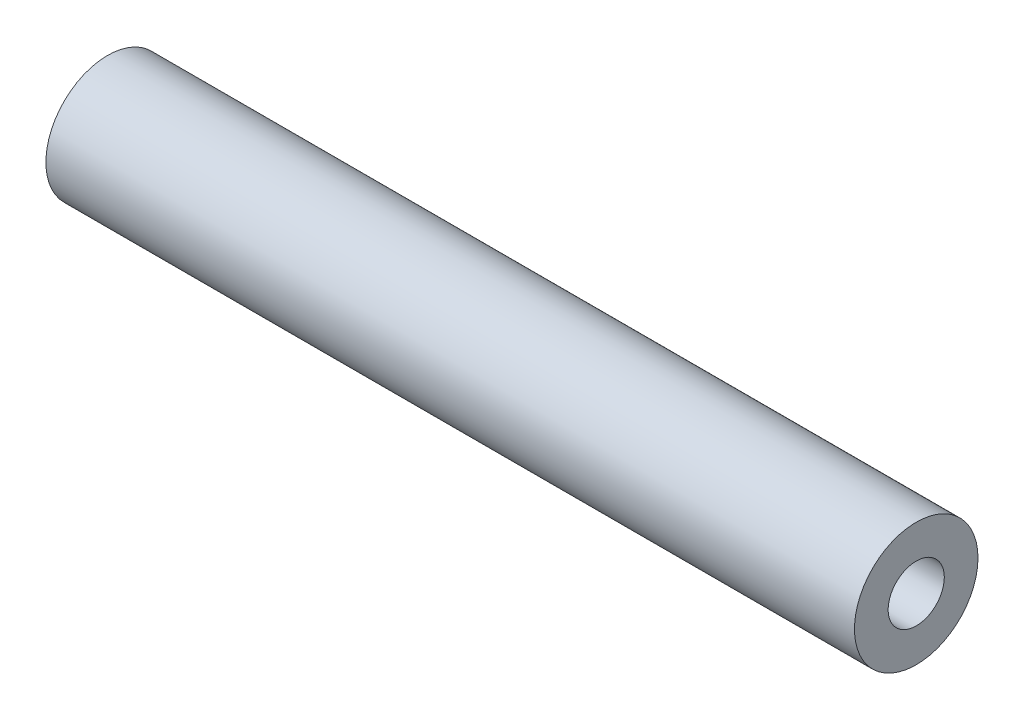
ISO-10303-21;
HEADER;
FILE_DESCRIPTION(('STEP AP214'),'2;1');
FILE_NAME('part.step','',(''),(''),'','','');
FILE_SCHEMA(('AUTOMOTIVE_DESIGN { 1 0 10303 214 1 1 1 1 }'));
ENDSEC;
DATA;
#1=APPLICATION_CONTEXT('core data for automotive mechanical design processes');
#2=APPLICATION_PROTOCOL_DEFINITION('international standard','automotive_design',2000,#1);
#3=PRODUCT_CONTEXT('',#1,'mechanical');
#4=PRODUCT('Part','Part','',(#3));
#5=PRODUCT_RELATED_PRODUCT_CATEGORY('part','',(#4));
#6=PRODUCT_DEFINITION_FORMATION('','',#4);
#7=PRODUCT_DEFINITION_CONTEXT('part definition',#1,'design');
#8=PRODUCT_DEFINITION('design','',#6,#7);
#9=PRODUCT_DEFINITION_SHAPE('','',#8);
#10=(LENGTH_UNIT() NAMED_UNIT(*) SI_UNIT(.MILLI.,.METRE.));
#11=(NAMED_UNIT(*) PLANE_ANGLE_UNIT() SI_UNIT($,.RADIAN.));
#12=(NAMED_UNIT(*) SI_UNIT($,.STERADIAN.) SOLID_ANGLE_UNIT());
#13=UNCERTAINTY_MEASURE_WITH_UNIT(LENGTH_MEASURE(1.E-05),#10,'distance_accuracy_value','');
#14=(GEOMETRIC_REPRESENTATION_CONTEXT(3) GLOBAL_UNCERTAINTY_ASSIGNED_CONTEXT((#13)) GLOBAL_UNIT_ASSIGNED_CONTEXT((#10,
#11,#12)) REPRESENTATION_CONTEXT('',''));
#15=CARTESIAN_POINT('',(0.,0.,0.));
#16=DIRECTION('',(0.,0.,1.));
#17=DIRECTION('',(1.,0.,0.));
#18=AXIS2_PLACEMENT_3D('',#15,#16,#17);
#19=CARTESIAN_POINT('',(45.72,0.,0.));
#20=DIRECTION('',(-1.,0.,0.));
#21=DIRECTION('',(0.,0.,1.));
#22=AXIS2_PLACEMENT_3D('',#19,#20,#21);
#23=CYLINDRICAL_SURFACE('',#22,1.5875);
#24=CARTESIAN_POINT('',(45.72,0.,0.));
#25=DIRECTION('',(1.,0.,0.));
#26=DIRECTION('',(0.,0.,-1.));
#27=AXIS2_PLACEMENT_3D('',#24,#25,#26);
#28=CIRCLE('',#27,1.5875);
#29=CARTESIAN_POINT('',(45.72,0.,-1.5875));
#30=VERTEX_POINT('',#29);
#31=EDGE_CURVE('E51',#30,#30,#28,.T.);
#32=ORIENTED_EDGE('',*,*,#31,.T.);
#33=EDGE_LOOP('',(#32));
#34=FACE_BOUND('',#33,.T.);
#35=CARTESIAN_POINT('',(0.,0.,0.));
#36=DIRECTION('',(1.,0.,0.));
#37=DIRECTION('',(0.,0.,-1.));
#38=AXIS2_PLACEMENT_3D('',#35,#36,#37);
#39=CIRCLE('',#38,1.5875);
#40=CARTESIAN_POINT('',(0.,0.,-1.5875));
#41=VERTEX_POINT('',#40);
#42=EDGE_CURVE('E58',#41,#41,#39,.T.);
#43=ORIENTED_EDGE('',*,*,#42,.F.);
#44=EDGE_LOOP('',(#43));
#45=FACE_BOUND('',#44,.T.);
#46=ADVANCED_FACE('F43',(#34,#45),#23,.F.);
#47=CARTESIAN_POINT('',(45.72,0.,0.));
#48=DIRECTION('',(-1.,0.,0.));
#49=DIRECTION('',(0.,0.,1.));
#50=AXIS2_PLACEMENT_3D('',#47,#48,#49);
#51=CYLINDRICAL_SURFACE('',#50,3.4925);
#52=CARTESIAN_POINT('',(45.72,0.,0.));
#53=DIRECTION('',(1.,0.,0.));
#54=DIRECTION('',(0.,0.,-1.));
#55=AXIS2_PLACEMENT_3D('',#52,#53,#54);
#56=CIRCLE('',#55,3.4925);
#57=CARTESIAN_POINT('',(45.72,0.,-3.4925));
#58=VERTEX_POINT('',#57);
#59=EDGE_CURVE('E10',#58,#58,#56,.T.);
#60=ORIENTED_EDGE('',*,*,#59,.F.);
#61=EDGE_LOOP('',(#60));
#62=FACE_BOUND('',#61,.T.);
#63=CARTESIAN_POINT('',(0.,0.,0.));
#64=DIRECTION('',(1.,0.,0.));
#65=DIRECTION('',(0.,0.,-1.));
#66=AXIS2_PLACEMENT_3D('',#63,#64,#65);
#67=CIRCLE('',#66,3.4925);
#68=CARTESIAN_POINT('',(0.,0.,-3.4925));
#69=VERTEX_POINT('',#68);
#70=EDGE_CURVE('E46',#69,#69,#67,.T.);
#71=ORIENTED_EDGE('',*,*,#70,.T.);
#72=EDGE_LOOP('',(#71));
#73=FACE_BOUND('',#72,.T.);
#74=ADVANCED_FACE('F67',(#62,#73),#51,.T.);
#75=CARTESIAN_POINT('',(45.72,0.,0.));
#76=DIRECTION('',(1.,0.,0.));
#77=DIRECTION('',(0.,0.,-1.));
#78=AXIS2_PLACEMENT_3D('',#75,#76,#77);
#79=PLANE('',#78);
#80=ORIENTED_EDGE('',*,*,#31,.F.);
#81=EDGE_LOOP('',(#80));
#82=FACE_BOUND('',#81,.T.);
#83=ORIENTED_EDGE('',*,*,#59,.T.);
#84=EDGE_LOOP('',(#83));
#85=FACE_BOUND('',#84,.T.);
#86=ADVANCED_FACE('F71',(#82,#85),#79,.T.);
#87=CARTESIAN_POINT('',(0.,0.,0.));
#88=DIRECTION('',(1.,0.,0.));
#89=DIRECTION('',(0.,0.,-1.));
#90=AXIS2_PLACEMENT_3D('',#87,#88,#89);
#91=PLANE('',#90);
#92=ORIENTED_EDGE('',*,*,#42,.T.);
#93=EDGE_LOOP('',(#92));
#94=FACE_BOUND('',#93,.T.);
#95=ORIENTED_EDGE('',*,*,#70,.F.);
#96=EDGE_LOOP('',(#95));
#97=FACE_BOUND('',#96,.T.);
#98=ADVANCED_FACE('F69',(#94,#97),#91,.F.);
#99=CLOSED_SHELL('',(#46,#74,#86,#98));
#100=MANIFOLD_SOLID_BREP('B2',#99);
#101=ADVANCED_BREP_SHAPE_REPRESENTATION('',(#18,#100),#14);
#102=SHAPE_DEFINITION_REPRESENTATION(#9,#101);
ENDSEC;
END-ISO-10303-21;
